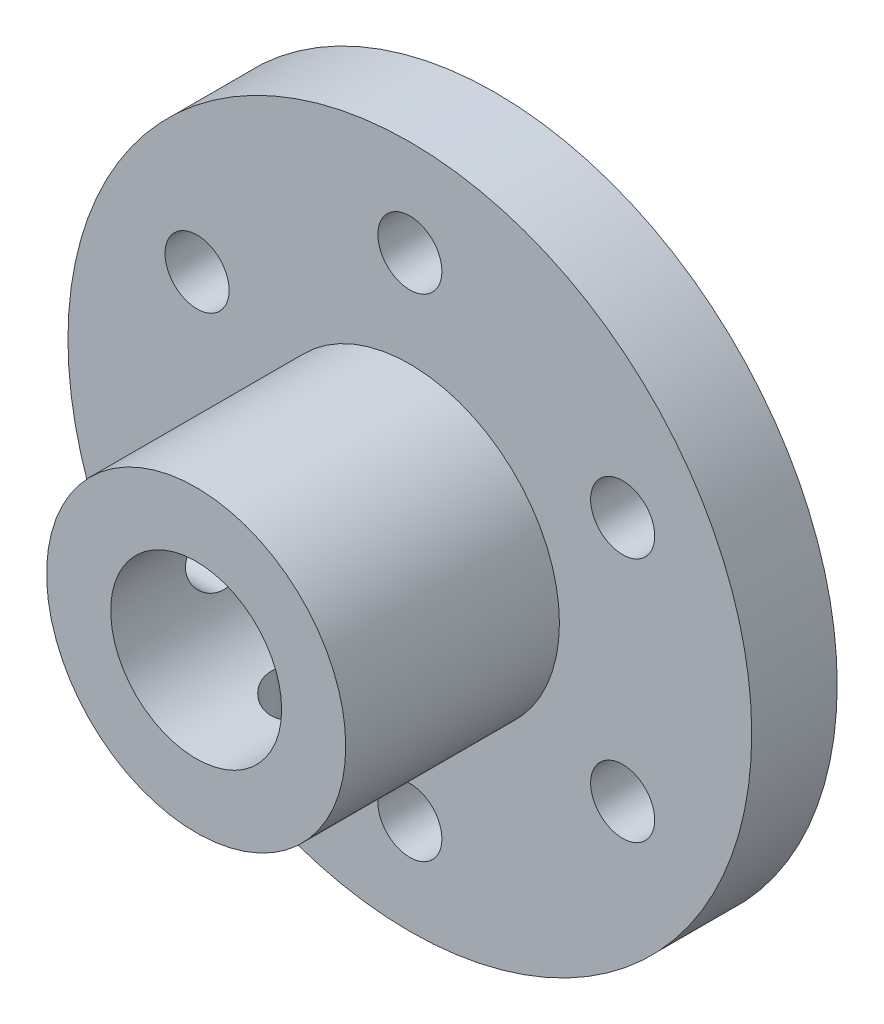
ISO-10303-21;
HEADER;
FILE_DESCRIPTION(('STEP AP214'),'2;1');
FILE_NAME('part.step','',(''),(''),'','','');
FILE_SCHEMA(('AUTOMOTIVE_DESIGN { 1 0 10303 214 1 1 1 1 }'));
ENDSEC;
DATA;
#1=APPLICATION_CONTEXT('core data for automotive mechanical design processes');
#2=APPLICATION_PROTOCOL_DEFINITION('international standard','automotive_design',2000,#1);
#3=PRODUCT_CONTEXT('',#1,'mechanical');
#4=PRODUCT('Part','Part','',(#3));
#5=PRODUCT_RELATED_PRODUCT_CATEGORY('part','',(#4));
#6=PRODUCT_DEFINITION_FORMATION('','',#4);
#7=PRODUCT_DEFINITION_CONTEXT('part definition',#1,'design');
#8=PRODUCT_DEFINITION('design','',#6,#7);
#9=PRODUCT_DEFINITION_SHAPE('','',#8);
#10=(LENGTH_UNIT() NAMED_UNIT(*) SI_UNIT(.MILLI.,.METRE.));
#11=(NAMED_UNIT(*) PLANE_ANGLE_UNIT() SI_UNIT($,.RADIAN.));
#12=(NAMED_UNIT(*) SI_UNIT($,.STERADIAN.) SOLID_ANGLE_UNIT());
#13=UNCERTAINTY_MEASURE_WITH_UNIT(LENGTH_MEASURE(1.E-05),#10,'distance_accuracy_value','');
#14=(GEOMETRIC_REPRESENTATION_CONTEXT(3) GLOBAL_UNCERTAINTY_ASSIGNED_CONTEXT((#13)) GLOBAL_UNIT_ASSIGNED_CONTEXT((#10,
#11,#12)) REPRESENTATION_CONTEXT('',''));
#15=CARTESIAN_POINT('',(0.,0.,0.));
#16=DIRECTION('',(0.,0.,1.));
#17=DIRECTION('',(1.,0.,0.));
#18=AXIS2_PLACEMENT_3D('',#15,#16,#17);
#19=CARTESIAN_POINT('',(0.,0.,4.));
#20=DIRECTION('',(0.,0.,1.));
#21=DIRECTION('',(1.,0.,0.));
#22=AXIS2_PLACEMENT_3D('',#19,#20,#21);
#23=PLANE('',#22);
#24=CARTESIAN_POINT('',(0.,0.,4.));
#25=DIRECTION('',(0.,0.,1.));
#26=DIRECTION('',(1.,0.,0.));
#27=AXIS2_PLACEMENT_3D('',#24,#25,#26);
#28=CIRCLE('',#27,7.);
#29=CARTESIAN_POINT('',(7.,0.,4.));
#30=VERTEX_POINT('',#29);
#31=EDGE_CURVE('E10',#30,#30,#28,.T.);
#32=ORIENTED_EDGE('',*,*,#31,.F.);
#33=EDGE_LOOP('',(#32));
#34=FACE_BOUND('',#33,.T.);
#35=CARTESIAN_POINT('',(9.95929214352109,5.74999999999991,4.));
#36=DIRECTION('',(0.,0.,1.));
#37=DIRECTION('',(1.,0.,0.));
#38=AXIS2_PLACEMENT_3D('',#35,#36,#37);
#39=CIRCLE('',#38,1.5);
#40=CARTESIAN_POINT('',(11.4592921435211,5.74999999999991,4.));
#41=VERTEX_POINT('',#40);
#42=EDGE_CURVE('E65',#41,#41,#39,.T.);
#43=ORIENTED_EDGE('',*,*,#42,.F.);
#44=EDGE_LOOP('',(#43));
#45=FACE_BOUND('',#44,.T.);
#46=CARTESIAN_POINT('',(-9.95929214352102,5.75000000000005,4.));
#47=DIRECTION('',(0.,0.,1.));
#48=DIRECTION('',(1.,0.,0.));
#49=AXIS2_PLACEMENT_3D('',#46,#47,#48);
#50=CIRCLE('',#49,1.5);
#51=CARTESIAN_POINT('',(-8.45929214352102,5.75000000000005,4.));
#52=VERTEX_POINT('',#51);
#53=EDGE_CURVE('E77',#52,#52,#50,.T.);
#54=ORIENTED_EDGE('',*,*,#53,.F.);
#55=EDGE_LOOP('',(#54));
#56=FACE_BOUND('',#55,.T.);
#57=CARTESIAN_POINT('',(0.,-11.5,4.));
#58=DIRECTION('',(0.,0.,1.));
#59=DIRECTION('',(1.,0.,0.));
#60=AXIS2_PLACEMENT_3D('',#57,#58,#59);
#61=CIRCLE('',#60,1.5);
#62=CARTESIAN_POINT('',(1.5,-11.5,4.));
#63=VERTEX_POINT('',#62);
#64=EDGE_CURVE('E89',#63,#63,#61,.T.);
#65=ORIENTED_EDGE('',*,*,#64,.F.);
#66=EDGE_LOOP('',(#65));
#67=FACE_BOUND('',#66,.T.);
#68=CARTESIAN_POINT('',(0.,0.,4.));
#69=DIRECTION('',(0.,0.,1.));
#70=DIRECTION('',(1.,0.,0.));
#71=AXIS2_PLACEMENT_3D('',#68,#69,#70);
#72=CIRCLE('',#71,16.);
#73=CARTESIAN_POINT('',(16.,0.,4.));
#74=VERTEX_POINT('',#73);
#75=EDGE_CURVE('E47',#74,#74,#72,.T.);
#76=ORIENTED_EDGE('',*,*,#75,.T.);
#77=EDGE_LOOP('',(#76));
#78=FACE_BOUND('',#77,.T.);
#79=CARTESIAN_POINT('',(-9.95929214352106,-5.74999999999998,4.));
#80=DIRECTION('',(0.,0.,1.));
#81=DIRECTION('',(1.,0.,0.));
#82=AXIS2_PLACEMENT_3D('',#79,#80,#81);
#83=CIRCLE('',#82,1.5);
#84=CARTESIAN_POINT('',(-8.45929214352106,-5.74999999999998,4.));
#85=VERTEX_POINT('',#84);
#86=EDGE_CURVE('E83',#85,#85,#83,.T.);
#87=ORIENTED_EDGE('',*,*,#86,.F.);
#88=EDGE_LOOP('',(#87));
#89=FACE_BOUND('',#88,.T.);
#90=CARTESIAN_POINT('',(0.,11.5,4.));
#91=DIRECTION('',(0.,0.,1.));
#92=DIRECTION('',(1.,0.,0.));
#93=AXIS2_PLACEMENT_3D('',#90,#91,#92);
#94=CIRCLE('',#93,1.5);
#95=CARTESIAN_POINT('',(1.50000000000008,11.5,4.));
#96=VERTEX_POINT('',#95);
#97=EDGE_CURVE('E71',#96,#96,#94,.T.);
#98=ORIENTED_EDGE('',*,*,#97,.F.);
#99=EDGE_LOOP('',(#98));
#100=FACE_BOUND('',#99,.T.);
#101=CARTESIAN_POINT('',(9.95929214352098,-5.75000000000012,4.));
#102=DIRECTION('',(0.,0.,1.));
#103=DIRECTION('',(1.,0.,0.));
#104=AXIS2_PLACEMENT_3D('',#101,#102,#103);
#105=CIRCLE('',#104,1.5);
#106=CARTESIAN_POINT('',(11.459292143521,-5.75000000000012,4.));
#107=VERTEX_POINT('',#106);
#108=EDGE_CURVE('E58',#107,#107,#105,.T.);
#109=ORIENTED_EDGE('',*,*,#108,.F.);
#110=EDGE_LOOP('',(#109));
#111=FACE_BOUND('',#110,.T.);
#112=ADVANCED_FACE('F34',(#34,#45,#56,#67,#78,#89,#100,#111),#23,.T.);
#113=CARTESIAN_POINT('',(0.,0.,0.));
#114=DIRECTION('',(0.,0.,1.));
#115=DIRECTION('',(1.,0.,0.));
#116=AXIS2_PLACEMENT_3D('',#113,#114,#115);
#117=PLANE('',#116);
#118=CARTESIAN_POINT('',(0.,0.,0.));
#119=DIRECTION('',(0.,0.,1.));
#120=DIRECTION('',(1.,0.,0.));
#121=AXIS2_PLACEMENT_3D('',#118,#119,#120);
#122=CIRCLE('',#121,16.);
#123=CARTESIAN_POINT('',(16.,0.,0.));
#124=VERTEX_POINT('',#123);
#125=EDGE_CURVE('E52',#124,#124,#122,.T.);
#126=ORIENTED_EDGE('',*,*,#125,.F.);
#127=EDGE_LOOP('',(#126));
#128=FACE_BOUND('',#127,.T.);
#129=CARTESIAN_POINT('',(0.,0.,0.));
#130=DIRECTION('',(0.,0.,1.));
#131=DIRECTION('',(1.,0.,0.));
#132=AXIS2_PLACEMENT_3D('',#129,#130,#131);
#133=CIRCLE('',#132,4.);
#134=CARTESIAN_POINT('',(4.,0.,0.));
#135=VERTEX_POINT('',#134);
#136=EDGE_CURVE('E92',#135,#135,#133,.T.);
#137=ORIENTED_EDGE('',*,*,#136,.T.);
#138=EDGE_LOOP('',(#137));
#139=FACE_BOUND('',#138,.T.);
#140=CARTESIAN_POINT('',(0.,-11.5,0.));
#141=DIRECTION('',(0.,0.,1.));
#142=DIRECTION('',(1.,0.,0.));
#143=AXIS2_PLACEMENT_3D('',#140,#141,#142);
#144=CIRCLE('',#143,1.5);
#145=CARTESIAN_POINT('',(1.5,-11.5,0.));
#146=VERTEX_POINT('',#145);
#147=EDGE_CURVE('E86',#146,#146,#144,.T.);
#148=ORIENTED_EDGE('',*,*,#147,.T.);
#149=EDGE_LOOP('',(#148));
#150=FACE_BOUND('',#149,.T.);
#151=CARTESIAN_POINT('',(-9.95929214352106,-5.74999999999998,0.));
#152=DIRECTION('',(0.,0.,1.));
#153=DIRECTION('',(1.,0.,0.));
#154=AXIS2_PLACEMENT_3D('',#151,#152,#153);
#155=CIRCLE('',#154,1.5);
#156=CARTESIAN_POINT('',(-8.45929214352106,-5.74999999999998,0.));
#157=VERTEX_POINT('',#156);
#158=EDGE_CURVE('E80',#157,#157,#155,.T.);
#159=ORIENTED_EDGE('',*,*,#158,.T.);
#160=EDGE_LOOP('',(#159));
#161=FACE_BOUND('',#160,.T.);
#162=CARTESIAN_POINT('',(-9.95929214352102,5.75000000000005,0.));
#163=DIRECTION('',(0.,0.,1.));
#164=DIRECTION('',(1.,0.,0.));
#165=AXIS2_PLACEMENT_3D('',#162,#163,#164);
#166=CIRCLE('',#165,1.5);
#167=CARTESIAN_POINT('',(-8.45929214352102,5.75000000000005,0.));
#168=VERTEX_POINT('',#167);
#169=EDGE_CURVE('E74',#168,#168,#166,.T.);
#170=ORIENTED_EDGE('',*,*,#169,.T.);
#171=EDGE_LOOP('',(#170));
#172=FACE_BOUND('',#171,.T.);
#173=CARTESIAN_POINT('',(0.,11.5,0.));
#174=DIRECTION('',(0.,0.,1.));
#175=DIRECTION('',(1.,0.,0.));
#176=AXIS2_PLACEMENT_3D('',#173,#174,#175);
#177=CIRCLE('',#176,1.5);
#178=CARTESIAN_POINT('',(1.50000000000008,11.5,0.));
#179=VERTEX_POINT('',#178);
#180=EDGE_CURVE('E68',#179,#179,#177,.T.);
#181=ORIENTED_EDGE('',*,*,#180,.T.);
#182=EDGE_LOOP('',(#181));
#183=FACE_BOUND('',#182,.T.);
#184=CARTESIAN_POINT('',(9.95929214352109,5.74999999999991,0.));
#185=DIRECTION('',(0.,0.,1.));
#186=DIRECTION('',(1.,0.,0.));
#187=AXIS2_PLACEMENT_3D('',#184,#185,#186);
#188=CIRCLE('',#187,1.5);
#189=CARTESIAN_POINT('',(11.4592921435211,5.74999999999991,0.));
#190=VERTEX_POINT('',#189);
#191=EDGE_CURVE('E61',#190,#190,#188,.T.);
#192=ORIENTED_EDGE('',*,*,#191,.T.);
#193=EDGE_LOOP('',(#192));
#194=FACE_BOUND('',#193,.T.);
#195=CARTESIAN_POINT('',(9.95929214352098,-5.75000000000012,0.));
#196=DIRECTION('',(0.,0.,1.));
#197=DIRECTION('',(1.,0.,0.));
#198=AXIS2_PLACEMENT_3D('',#195,#196,#197);
#199=CIRCLE('',#198,1.5);
#200=CARTESIAN_POINT('',(11.459292143521,-5.75000000000012,0.));
#201=VERTEX_POINT('',#200);
#202=EDGE_CURVE('E62',#201,#201,#199,.T.);
#203=ORIENTED_EDGE('',*,*,#202,.T.);
#204=EDGE_LOOP('',(#203));
#205=FACE_BOUND('',#204,.T.);
#206=ADVANCED_FACE('F139',(#128,#139,#150,#161,#172,#183,#194,#205),#117,.F.);
#207=CARTESIAN_POINT('',(0.,0.,4.));
#208=DIRECTION('',(0.,0.,-1.));
#209=DIRECTION('',(-1.,0.,0.));
#210=AXIS2_PLACEMENT_3D('',#207,#208,#209);
#211=CYLINDRICAL_SURFACE('',#210,16.);
#212=ORIENTED_EDGE('',*,*,#75,.F.);
#213=EDGE_LOOP('',(#212));
#214=FACE_BOUND('',#213,.T.);
#215=ORIENTED_EDGE('',*,*,#125,.T.);
#216=EDGE_LOOP('',(#215));
#217=FACE_BOUND('',#216,.T.);
#218=ADVANCED_FACE('F36',(#214,#217),#211,.T.);
#219=CARTESIAN_POINT('',(0.,0.,4.));
#220=DIRECTION('',(0.,0.,-1.));
#221=DIRECTION('',(-1.,0.,0.));
#222=AXIS2_PLACEMENT_3D('',#219,#220,#221);
#223=CYLINDRICAL_SURFACE('',#222,4.);
#224=CARTESIAN_POINT('',(-4.,0.,10.5));
#225=CARTESIAN_POINT('',(-4.00000217456151,-0.0812350589378527,10.5000029023031));
#226=CARTESIAN_POINT('',(-3.99750379283184,-0.162450241781792,10.4933802397516));
#227=CARTESIAN_POINT('',(-3.98778696006928,-0.322453452352361,10.4671718047301));
#228=CARTESIAN_POINT('',(-3.98056918893993,-0.401241827987615,10.4475878995294));
#229=CARTESIAN_POINT('',(-3.96218832391545,-0.554060784990878,10.3962469982282));
#230=CARTESIAN_POINT('',(-3.9510328434944,-0.628100224162277,10.3645134831782));
#231=CARTESIAN_POINT('',(-3.92588767765353,-0.769799310160253,10.2898935869842));
#232=CARTESIAN_POINT('',(-3.91189723227548,-0.837457239177879,10.2470042144558));
#233=CARTESIAN_POINT('',(-3.88186246971217,-0.967346417045825,10.1493874689291));
#234=CARTESIAN_POINT('',(-3.86576002583566,-1.02927073015119,10.0942697377406));
#235=CARTESIAN_POINT('',(-3.83360220871327,-1.14324421474363,9.97458956534116));
#236=CARTESIAN_POINT('',(-3.81754685135033,-1.19529036359203,9.91002424391213));
#237=CARTESIAN_POINT('',(-3.78662470617731,-1.28998202215985,9.77028253247679));
#238=CARTESIAN_POINT('',(-3.77182648820818,-1.3321939319576,9.69479563345418));
#239=CARTESIAN_POINT('',(-3.74599860237433,-1.40318646334084,9.53715164583148));
#240=CARTESIAN_POINT('',(-3.73496742975881,-1.43197244961239,9.4549972368449));
#241=CARTESIAN_POINT('',(-3.71854412824136,-1.47408431017549,9.2898832597418));
#242=CARTESIAN_POINT('',(-3.71293924350838,-1.48799593218558,9.20709496156456));
#243=CARTESIAN_POINT('',(-3.70738061461215,-1.50179556531648,9.04018384200616));
#244=CARTESIAN_POINT('',(-3.70742453659305,-1.5016893680263,8.95606158612553));
#245=CARTESIAN_POINT('',(-3.71297511632055,-1.48790429610018,8.79423047478704));
#246=CARTESIAN_POINT('',(-3.71815468871122,-1.47503808509003,8.71643909395583));
#247=CARTESIAN_POINT('',(-3.73284938059529,-1.4374416786833,8.56421284959468));
#248=CARTESIAN_POINT('',(-3.74236515298863,-1.41270969663258,8.48977849338612));
#249=CARTESIAN_POINT('',(-3.76485702190253,-1.35163748571904,8.34472293227177));
#250=CARTESIAN_POINT('',(-3.77789517988166,-1.31508648737101,8.2742005138787));
#251=CARTESIAN_POINT('',(-3.80594210139319,-1.23156073762698,8.14005426240903));
#252=CARTESIAN_POINT('',(-3.82095154457158,-1.18458238728897,8.0764328224803));
#253=CARTESIAN_POINT('',(-3.85248038859113,-1.07781780766549,7.95339633634913));
#254=CARTESIAN_POINT('',(-3.86903347455671,-1.01738298716956,7.89455135925191));
#255=CARTESIAN_POINT('',(-3.90091728164085,-0.887312590819021,7.7876620337942));
#256=CARTESIAN_POINT('',(-3.91624781465952,-0.817675603497364,7.73961934539433));
#257=CARTESIAN_POINT('',(-3.9442639480908,-0.669723436992419,7.65506960293748));
#258=CARTESIAN_POINT('',(-3.95690498259616,-0.591290713844719,7.61875241877894));
#259=CARTESIAN_POINT('',(-3.97778718326962,-0.428836850524583,7.56001739572996));
#260=CARTESIAN_POINT('',(-3.98603030341493,-0.344818210845767,7.53759338343888));
#261=CARTESIAN_POINT('',(-3.99684443228065,-0.178375243148665,7.50837721245806));
#262=CARTESIAN_POINT('',(-3.99969369025686,-0.0961036195622094,7.50081739361749));
#263=CARTESIAN_POINT('',(-4.00025893700126,0.0685724752550239,7.49930893610008));
#264=CARTESIAN_POINT('',(-3.99797606386863,0.150976912983372,7.50535727968323));
#265=CARTESIAN_POINT('',(-3.98871709772643,0.310262048561859,7.53031004230867));
#266=CARTESIAN_POINT('',(-3.98192470962305,0.387233328007335,7.54871154373709));
#267=CARTESIAN_POINT('',(-3.96451477091717,0.53694175495722,7.59718607254732));
#268=CARTESIAN_POINT('',(-3.9538967228203,0.609678350347534,7.62726061794804));
#269=CARTESIAN_POINT('',(-3.92949624407681,0.751247765110155,7.69918641243948));
#270=CARTESIAN_POINT('',(-3.91563000209348,0.819903083557795,7.74135772922339));
#271=CARTESIAN_POINT('',(-3.88626671564664,0.949392711726625,7.83591810317156));
#272=CARTESIAN_POINT('',(-3.87076907009516,1.01022412027045,7.88831093254515));
#273=CARTESIAN_POINT('',(-3.8387332949099,1.12603079874454,8.00540412212428));
#274=CARTESIAN_POINT('',(-3.82218696503729,1.18046154123568,8.0706421827727));
#275=CARTESIAN_POINT('',(-3.79078815746854,1.27771050031903,8.20965138470766));
#276=CARTESIAN_POINT('',(-3.77593583194399,1.32052767414518,8.2834232913885));
#277=CARTESIAN_POINT('',(-3.74966829822463,1.39337773518998,8.43801598677232));
#278=CARTESIAN_POINT('',(-3.73826760328493,1.42335685446918,8.51886474591044));
#279=CARTESIAN_POINT('',(-3.72054032891005,1.46907883466889,8.68500976368782));
#280=CARTESIAN_POINT('',(-3.71421061057491,1.48483050305535,8.77030323619812));
#281=CARTESIAN_POINT('',(-3.70775894792573,1.50086347097839,8.93701615954112));
#282=CARTESIAN_POINT('',(-3.70726444523341,1.50207331495837,9.01833263171689));
#283=CARTESIAN_POINT('',(-3.71158412745292,1.49136715641593,9.17994531627617));
#284=CARTESIAN_POINT('',(-3.71639780898899,1.47945239850124,9.26024162467158));
#285=CARTESIAN_POINT('',(-3.73048141585432,1.44355815630242,9.41504722671655));
#286=CARTESIAN_POINT('',(-3.73961085376663,1.41995798316524,9.48965834624534));
#287=CARTESIAN_POINT('',(-3.76121548297845,1.3616969677992,9.63390550849442));
#288=CARTESIAN_POINT('',(-3.77369151995215,1.32703332944945,9.70354028807014));
#289=CARTESIAN_POINT('',(-3.80139723903965,1.24552075938154,9.83982678969763));
#290=CARTESIAN_POINT('',(-3.81673698440964,1.1981283280301,9.90613079679991));
#291=CARTESIAN_POINT('',(-3.84806246757177,1.09334485729906,10.0301415609712));
#292=CARTESIAN_POINT('',(-3.86404840943145,1.03595064012808,10.0878455747868));
#293=CARTESIAN_POINT('',(-3.89590424609881,0.909080396784623,10.1962019558218));
#294=CARTESIAN_POINT('',(-3.91172104900645,0.839118644212993,10.2463037534347));
#295=CARTESIAN_POINT('',(-3.94054514457031,0.691213223200822,10.3340226552766));
#296=CARTESIAN_POINT('',(-3.95355221851559,0.613268934090622,10.3716387877364));
#297=CARTESIAN_POINT('',(-3.9757429260668,0.447999082002313,10.4343768290483));
#298=CARTESIAN_POINT('',(-3.98473657158356,0.360413422234209,10.4588870646019));
#299=CARTESIAN_POINT('',(-3.99686242179587,0.181875733606382,10.4916929599207));
#300=CARTESIAN_POINT('',(-3.99999756603967,0.0909254163648591,10.4999967514873));
#301=CARTESIAN_POINT('',(-4.,0.,10.5));
#302=B_SPLINE_CURVE_WITH_KNOTS('',3,(#224,#225,#226,#227,#228,#229,#230,#231,#232,#233,#234,
#235,#236,#237,#238,#239,#240,#241,#242,#243,#244,#245,#246,#247,#248,#249,#250,#251,#252,#253,
#254,#255,#256,#257,#258,#259,#260,#261,#262,#263,#264,#265,#266,#267,#268,#269,#270,#271,#272,
#273,#274,#275,#276,#277,#278,#279,#280,#281,#282,#283,#284,#285,#286,#287,#288,#289,#290,#291,
#292,#293,#294,#295,#296,#297,#298,#299,#300,#301),.UNSPECIFIED.,.T.,.F.,(4,2,2,2,2,2,2,2,2,2,2,
2,2,2,2,2,2,2,2,2,2,2,2,2,2,2,2,2,2,2,2,2,2,2,2,2,2,2,4),(0.,0.243369801560559,0.48670454953046,
0.729571369213572,0.972503379609489,1.22473618582715,1.47704604925622,1.73896674501659,
2.00078269352134,2.25185874416901,2.50283106079707,2.73878345119971,2.97477138060589,
3.21522408387018,3.45575990744258,3.71246153335812,3.96920257905066,4.22991375286075,
4.49050899698846,4.73725019635925,4.9839366839052,5.2211443792384,5.45838293254453,
5.70259221859599,5.94689180019868,6.20536519455657,6.46386178920141,6.72343066727203,
6.98283874956506,7.22558763480252,7.46831350211258,7.70363142426533,7.93900886656506,
8.1867247188427,8.43451941997061,8.69572329654038,8.95694749805102,9.22948515032042,
9.50188601796127),.UNSPECIFIED.);
#303=CARTESIAN_POINT('',(-4.,0.,10.5));
#304=VERTEX_POINT('',#303);
#305=EDGE_CURVE('E105',#304,#304,#302,.T.);
#306=ORIENTED_EDGE('',*,*,#305,.F.);
#307=EDGE_LOOP('',(#306));
#308=FACE_BOUND('',#307,.T.);
#309=CARTESIAN_POINT('',(0.,-4.,10.5));
#310=CARTESIAN_POINT('',(0.0812350589378528,-4.00000217456151,10.5000029023031));
#311=CARTESIAN_POINT('',(0.162450241781792,-3.99750379283184,10.4933802397516));
#312=CARTESIAN_POINT('',(0.322453452352361,-3.98778696006928,10.4671718047301));
#313=CARTESIAN_POINT('',(0.401241827987615,-3.98056918893993,10.4475878995294));
#314=CARTESIAN_POINT('',(0.554060784990879,-3.96218832391545,10.3962469982282));
#315=CARTESIAN_POINT('',(0.628100224162279,-3.9510328434944,10.3645134831782));
#316=CARTESIAN_POINT('',(0.769799310160254,-3.92588767765353,10.2898935869842));
#317=CARTESIAN_POINT('',(0.837457239177879,-3.91189723227548,10.2470042144558));
#318=CARTESIAN_POINT('',(0.967346417045825,-3.88186246971217,10.1493874689291));
#319=CARTESIAN_POINT('',(1.02927073015119,-3.86576002583566,10.0942697377406));
#320=CARTESIAN_POINT('',(1.14324421474363,-3.83360220871327,9.97458956534116));
#321=CARTESIAN_POINT('',(1.19529036359203,-3.81754685135033,9.91002424391213));
#322=CARTESIAN_POINT('',(1.28998202215985,-3.78662470617731,9.77028253247679));
#323=CARTESIAN_POINT('',(1.3321939319576,-3.77182648820818,9.69479563345418));
#324=CARTESIAN_POINT('',(1.40318646334084,-3.74599860237433,9.53715164583148));
#325=CARTESIAN_POINT('',(1.43197244961239,-3.73496742975881,9.4549972368449));
#326=CARTESIAN_POINT('',(1.47408431017549,-3.71854412824136,9.2898832597418));
#327=CARTESIAN_POINT('',(1.48799593218558,-3.71293924350838,9.20709496156456));
#328=CARTESIAN_POINT('',(1.50179556531648,-3.70738061461215,9.04018384200616));
#329=CARTESIAN_POINT('',(1.5016893680263,-3.70742453659305,8.95606158612553));
#330=CARTESIAN_POINT('',(1.48790429610018,-3.71297511632055,8.79423047478704));
#331=CARTESIAN_POINT('',(1.47503808509003,-3.71815468871122,8.71643909395583));
#332=CARTESIAN_POINT('',(1.4374416786833,-3.73284938059529,8.56421284959468));
#333=CARTESIAN_POINT('',(1.41270969663258,-3.74236515298863,8.48977849338612));
#334=CARTESIAN_POINT('',(1.35163748571904,-3.76485702190253,8.34472293227177));
#335=CARTESIAN_POINT('',(1.31508648737101,-3.77789517988166,8.2742005138787));
#336=CARTESIAN_POINT('',(1.23156073762698,-3.80594210139319,8.14005426240903));
#337=CARTESIAN_POINT('',(1.18458238728896,-3.82095154457158,8.0764328224803));
#338=CARTESIAN_POINT('',(1.07781780766549,-3.85248038859113,7.95339633634912));
#339=CARTESIAN_POINT('',(1.01738298716955,-3.86903347455671,7.89455135925191));
#340=CARTESIAN_POINT('',(0.88731259081902,-3.90091728164086,7.7876620337942));
#341=CARTESIAN_POINT('',(0.817675603497364,-3.91624781465952,7.73961934539433));
#342=CARTESIAN_POINT('',(0.669723436992419,-3.9442639480908,7.65506960293748));
#343=CARTESIAN_POINT('',(0.591290713844718,-3.95690498259616,7.61875241877894));
#344=CARTESIAN_POINT('',(0.428836850524582,-3.97778718326962,7.56001739572996));
#345=CARTESIAN_POINT('',(0.344818210845767,-3.98603030341493,7.53759338343888));
#346=CARTESIAN_POINT('',(0.178375243148665,-3.99684443228065,7.50837721245806));
#347=CARTESIAN_POINT('',(0.0961036195622093,-3.99969369025686,7.50081739361749));
#348=CARTESIAN_POINT('',(-0.0685724752550243,-4.00025893700126,7.49930893610008));
#349=CARTESIAN_POINT('',(-0.150976912983373,-3.99797606386863,7.50535727968322));
#350=CARTESIAN_POINT('',(-0.310262048561859,-3.98871709772643,7.53031004230867));
#351=CARTESIAN_POINT('',(-0.387233328007336,-3.98192470962305,7.54871154373709));
#352=CARTESIAN_POINT('',(-0.536941754957221,-3.96451477091717,7.59718607254732));
#353=CARTESIAN_POINT('',(-0.609678350347535,-3.9538967228203,7.62726061794804));
#354=CARTESIAN_POINT('',(-0.751247765110156,-3.92949624407681,7.69918641243948));
#355=CARTESIAN_POINT('',(-0.819903083557796,-3.91563000209348,7.74135772922339));
#356=CARTESIAN_POINT('',(-0.949392711726626,-3.88626671564664,7.83591810317156));
#357=CARTESIAN_POINT('',(-1.01022412027045,-3.87076907009516,7.88831093254515));
#358=CARTESIAN_POINT('',(-1.12603079874454,-3.8387332949099,8.00540412212428));
#359=CARTESIAN_POINT('',(-1.18046154123569,-3.82218696503729,8.0706421827727));
#360=CARTESIAN_POINT('',(-1.27771050031903,-3.79078815746854,8.20965138470766));
#361=CARTESIAN_POINT('',(-1.32052767414518,-3.77593583194399,8.2834232913885));
#362=CARTESIAN_POINT('',(-1.39337773518998,-3.74966829822463,8.43801598677231));
#363=CARTESIAN_POINT('',(-1.42335685446918,-3.73826760328493,8.51886474591043));
#364=CARTESIAN_POINT('',(-1.46907883466889,-3.72054032891005,8.68500976368782));
#365=CARTESIAN_POINT('',(-1.48483050305535,-3.71421061057491,8.77030323619812));
#366=CARTESIAN_POINT('',(-1.50086347097839,-3.70775894792573,8.93701615954112));
#367=CARTESIAN_POINT('',(-1.50207331495837,-3.70726444523341,9.01833263171689));
#368=CARTESIAN_POINT('',(-1.49136715641593,-3.71158412745292,9.17994531627617));
#369=CARTESIAN_POINT('',(-1.47945239850124,-3.71639780898899,9.26024162467158));
#370=CARTESIAN_POINT('',(-1.44355815630242,-3.73048141585432,9.41504722671655));
#371=CARTESIAN_POINT('',(-1.41995798316524,-3.73961085376663,9.48965834624535));
#372=CARTESIAN_POINT('',(-1.3616969677992,-3.76121548297845,9.63390550849442));
#373=CARTESIAN_POINT('',(-1.32703332944945,-3.77369151995215,9.70354028807014));
#374=CARTESIAN_POINT('',(-1.24552075938154,-3.80139723903965,9.83982678969763));
#375=CARTESIAN_POINT('',(-1.1981283280301,-3.81673698440964,9.90613079679991));
#376=CARTESIAN_POINT('',(-1.09334485729906,-3.84806246757177,10.0301415609712));
#377=CARTESIAN_POINT('',(-1.03595064012808,-3.86404840943145,10.0878455747868));
#378=CARTESIAN_POINT('',(-0.909080396784623,-3.89590424609881,10.1962019558218));
#379=CARTESIAN_POINT('',(-0.839118644212993,-3.91172104900645,10.2463037534347));
#380=CARTESIAN_POINT('',(-0.691213223200821,-3.94054514457031,10.3340226552766));
#381=CARTESIAN_POINT('',(-0.613268934090621,-3.95355221851559,10.3716387877364));
#382=CARTESIAN_POINT('',(-0.447999082002311,-3.9757429260668,10.4343768290483));
#383=CARTESIAN_POINT('',(-0.360413422234207,-3.98473657158356,10.4588870646019));
#384=CARTESIAN_POINT('',(-0.181875733606381,-3.99686242179587,10.4916929599207));
#385=CARTESIAN_POINT('',(-0.0909254163648585,-3.99999756603967,10.4999967514873));
#386=CARTESIAN_POINT('',(0.,-4.,10.5));
#387=B_SPLINE_CURVE_WITH_KNOTS('',3,(#309,#310,#311,#312,#313,#314,#315,#316,#317,#318,#319,
#320,#321,#322,#323,#324,#325,#326,#327,#328,#329,#330,#331,#332,#333,#334,#335,#336,#337,#338,
#339,#340,#341,#342,#343,#344,#345,#346,#347,#348,#349,#350,#351,#352,#353,#354,#355,#356,#357,
#358,#359,#360,#361,#362,#363,#364,#365,#366,#367,#368,#369,#370,#371,#372,#373,#374,#375,#376,
#377,#378,#379,#380,#381,#382,#383,#384,#385,#386),.UNSPECIFIED.,.T.,.F.,(4,2,2,2,2,2,2,2,2,2,2,
2,2,2,2,2,2,2,2,2,2,2,2,2,2,2,2,2,2,2,2,2,2,2,2,2,2,2,4),(0.,0.243369801560559,0.48670454953046,
0.729571369213574,0.972503379609489,1.22473618582715,1.47704604925622,1.73896674501658,
2.00078269352134,2.25185874416901,2.50283106079707,2.73878345119971,2.97477138060589,
3.21522408387018,3.45575990744258,3.71246153335813,3.96920257905066,4.22991375286075,
4.49050899698846,4.73725019635925,4.9839366839052,5.2211443792384,5.45838293254453,
5.702592218596,5.94689180019868,6.20536519455658,6.46386178920141,6.72343066727204,
6.98283874956507,7.22558763480252,7.46831350211259,7.70363142426533,7.93900886656506,
8.1867247188427,8.43451941997062,8.69572329654039,8.95694749805102,9.22948515032042,
9.50188601796127),.UNSPECIFIED.);
#388=CARTESIAN_POINT('',(0.,-4.,10.5));
#389=VERTEX_POINT('',#388);
#390=EDGE_CURVE('E104',#389,#389,#387,.T.);
#391=ORIENTED_EDGE('',*,*,#390,.F.);
#392=EDGE_LOOP('',(#391));
#393=FACE_BOUND('',#392,.T.);
#394=ORIENTED_EDGE('',*,*,#136,.F.);
#395=EDGE_LOOP('',(#394));
#396=FACE_BOUND('',#395,.T.);
#397=CARTESIAN_POINT('',(0.,0.,14.));
#398=DIRECTION('',(0.,0.,1.));
#399=DIRECTION('',(1.,0.,0.));
#400=AXIS2_PLACEMENT_3D('',#397,#398,#399);
#401=CIRCLE('',#400,4.);
#402=CARTESIAN_POINT('',(4.,0.,14.));
#403=VERTEX_POINT('',#402);
#404=EDGE_CURVE('E125',#403,#403,#401,.T.);
#405=ORIENTED_EDGE('',*,*,#404,.T.);
#406=EDGE_LOOP('',(#405));
#407=FACE_BOUND('',#406,.T.);
#408=ADVANCED_FACE('F129',(#308,#393,#396,#407),#223,.F.);
#409=CARTESIAN_POINT('',(0.,-11.5,4.));
#410=DIRECTION('',(0.,0.,-1.));
#411=DIRECTION('',(-1.,0.,0.));
#412=AXIS2_PLACEMENT_3D('',#409,#410,#411);
#413=CYLINDRICAL_SURFACE('',#412,1.5);
#414=ORIENTED_EDGE('',*,*,#64,.T.);
#415=EDGE_LOOP('',(#414));
#416=FACE_BOUND('',#415,.T.);
#417=ORIENTED_EDGE('',*,*,#147,.F.);
#418=EDGE_LOOP('',(#417));
#419=FACE_BOUND('',#418,.T.);
#420=ADVANCED_FACE('F134',(#416,#419),#413,.F.);
#421=CARTESIAN_POINT('',(-9.95929214352106,-5.74999999999998,4.));
#422=DIRECTION('',(0.,0.,-1.));
#423=DIRECTION('',(-1.,0.,0.));
#424=AXIS2_PLACEMENT_3D('',#421,#422,#423);
#425=CYLINDRICAL_SURFACE('',#424,1.5);
#426=ORIENTED_EDGE('',*,*,#86,.T.);
#427=EDGE_LOOP('',(#426));
#428=FACE_BOUND('',#427,.T.);
#429=ORIENTED_EDGE('',*,*,#158,.F.);
#430=EDGE_LOOP('',(#429));
#431=FACE_BOUND('',#430,.T.);
#432=ADVANCED_FACE('F181',(#428,#431),#425,.F.);
#433=CARTESIAN_POINT('',(-9.95929214352102,5.75000000000005,4.));
#434=DIRECTION('',(0.,0.,-1.));
#435=DIRECTION('',(-1.,0.,0.));
#436=AXIS2_PLACEMENT_3D('',#433,#434,#435);
#437=CYLINDRICAL_SURFACE('',#436,1.5);
#438=ORIENTED_EDGE('',*,*,#53,.T.);
#439=EDGE_LOOP('',(#438));
#440=FACE_BOUND('',#439,.T.);
#441=ORIENTED_EDGE('',*,*,#169,.F.);
#442=EDGE_LOOP('',(#441));
#443=FACE_BOUND('',#442,.T.);
#444=ADVANCED_FACE('F178',(#440,#443),#437,.F.);
#445=CARTESIAN_POINT('',(0.,11.5,4.));
#446=DIRECTION('',(0.,0.,-1.));
#447=DIRECTION('',(-1.,0.,0.));
#448=AXIS2_PLACEMENT_3D('',#445,#446,#447);
#449=CYLINDRICAL_SURFACE('',#448,1.5);
#450=ORIENTED_EDGE('',*,*,#97,.T.);
#451=EDGE_LOOP('',(#450));
#452=FACE_BOUND('',#451,.T.);
#453=ORIENTED_EDGE('',*,*,#180,.F.);
#454=EDGE_LOOP('',(#453));
#455=FACE_BOUND('',#454,.T.);
#456=ADVANCED_FACE('F172',(#452,#455),#449,.F.);
#457=CARTESIAN_POINT('',(9.95929214352109,5.74999999999991,4.));
#458=DIRECTION('',(0.,0.,-1.));
#459=DIRECTION('',(-1.,0.,0.));
#460=AXIS2_PLACEMENT_3D('',#457,#458,#459);
#461=CYLINDRICAL_SURFACE('',#460,1.5);
#462=ORIENTED_EDGE('',*,*,#42,.T.);
#463=EDGE_LOOP('',(#462));
#464=FACE_BOUND('',#463,.T.);
#465=ORIENTED_EDGE('',*,*,#191,.F.);
#466=EDGE_LOOP('',(#465));
#467=FACE_BOUND('',#466,.T.);
#468=ADVANCED_FACE('F165',(#464,#467),#461,.F.);
#469=CARTESIAN_POINT('',(9.95929214352098,-5.75000000000012,4.));
#470=DIRECTION('',(0.,0.,-1.));
#471=DIRECTION('',(-1.,0.,0.));
#472=AXIS2_PLACEMENT_3D('',#469,#470,#471);
#473=CYLINDRICAL_SURFACE('',#472,1.5);
#474=ORIENTED_EDGE('',*,*,#108,.T.);
#475=EDGE_LOOP('',(#474));
#476=FACE_BOUND('',#475,.T.);
#477=ORIENTED_EDGE('',*,*,#202,.F.);
#478=EDGE_LOOP('',(#477));
#479=FACE_BOUND('',#478,.T.);
#480=ADVANCED_FACE('F163',(#476,#479),#473,.F.);
#481=CARTESIAN_POINT('',(0.,0.,14.));
#482=DIRECTION('',(0.,0.,1.));
#483=DIRECTION('',(1.,0.,0.));
#484=AXIS2_PLACEMENT_3D('',#481,#482,#483);
#485=PLANE('',#484);
#486=CARTESIAN_POINT('',(0.,0.,14.));
#487=DIRECTION('',(0.,0.,1.));
#488=DIRECTION('',(1.,0.,0.));
#489=AXIS2_PLACEMENT_3D('',#486,#487,#488);
#490=CIRCLE('',#489,7.);
#491=CARTESIAN_POINT('',(7.,0.,14.));
#492=VERTEX_POINT('',#491);
#493=EDGE_CURVE('E56',#492,#492,#490,.T.);
#494=ORIENTED_EDGE('',*,*,#493,.T.);
#495=EDGE_LOOP('',(#494));
#496=FACE_BOUND('',#495,.T.);
#497=ORIENTED_EDGE('',*,*,#404,.F.);
#498=EDGE_LOOP('',(#497));
#499=FACE_BOUND('',#498,.T.);
#500=ADVANCED_FACE('F116',(#496,#499),#485,.T.);
#501=CARTESIAN_POINT('',(0.,0.,14.));
#502=DIRECTION('',(0.,0.,-1.));
#503=DIRECTION('',(-1.,0.,0.));
#504=AXIS2_PLACEMENT_3D('',#501,#502,#503);
#505=CYLINDRICAL_SURFACE('',#504,7.);
#506=CARTESIAN_POINT('',(-7.,0.,10.5));
#507=CARTESIAN_POINT('',(-6.99999846043226,-0.0832358860906164,10.4999971004257));
#508=CARTESIAN_POINT('',(-6.9985002594971,-0.166507195600274,10.4930483916121));
#509=CARTESIAN_POINT('',(-6.99266829827728,-0.330687344293327,10.4654643431464));
#510=CARTESIAN_POINT('',(-6.98833245637099,-0.41159440357119,10.4448189558051));
#511=CARTESIAN_POINT('',(-6.97730831788826,-0.568649323817736,10.390515635392));
#512=CARTESIAN_POINT('',(-6.97062242967171,-0.644801963446555,10.3568710206187));
#513=CARTESIAN_POINT('',(-6.95562106817971,-0.790378177960786,10.2775659138287));
#514=CARTESIAN_POINT('',(-6.94730565036661,-0.859801981747368,10.2319058307501));
#515=CARTESIAN_POINT('',(-6.92981369246311,-0.991024790535229,10.1291197003265));
#516=CARTESIAN_POINT('',(-6.92062683143259,-1.05270503419445,10.0718437781015));
#517=CARTESIAN_POINT('',(-6.90250069814144,-1.16566042389435,9.9477736843148));
#518=CARTESIAN_POINT('',(-6.8935614473163,-1.21693467150908,9.88097869174874));
#519=CARTESIAN_POINT('',(-6.87684116047225,-1.30814204379808,9.73889424713957));
#520=CARTESIAN_POINT('',(-6.8690733634436,-1.34794958335009,9.66352248224379));
#521=CARTESIAN_POINT('',(-6.85572325558537,-1.41428823691147,9.50696554623316));
#522=CARTESIAN_POINT('',(-6.85014069470711,-1.44082087001716,9.42578104150743));
#523=CARTESIAN_POINT('',(-6.84189808926311,-1.47946574422454,9.26118891341193));
#524=CARTESIAN_POINT('',(-6.83919556896486,-1.49178779748342,9.17783272433614));
#525=CARTESIAN_POINT('',(-6.83689139845106,-1.50231395206577,9.01019576749301));
#526=CARTESIAN_POINT('',(-6.83728938291729,-1.50051971664629,8.92591510982005));
#527=CARTESIAN_POINT('',(-6.84110276603832,-1.48303326340861,8.76037531206621));
#528=CARTESIAN_POINT('',(-6.84446541682162,-1.46758398649408,8.67908911089985));
#529=CARTESIAN_POINT('',(-6.85374593375788,-1.42361054298677,8.52028975971066));
#530=CARTESIAN_POINT('',(-6.85966393808402,-1.39508566936466,8.44277681396768));
#531=CARTESIAN_POINT('',(-6.87344080755724,-1.32554551075991,8.29303712712666));
#532=CARTESIAN_POINT('',(-6.88131420983365,-1.2844361097283,8.22085548728745));
#533=CARTESIAN_POINT('',(-6.89810572501288,-1.19096007283993,8.08432483504205));
#534=CARTESIAN_POINT('',(-6.90702397481896,-1.13859196103562,8.0199768513138));
#535=CARTESIAN_POINT('',(-6.92512718393878,-1.0227954275532,7.8995406443266));
#536=CARTESIAN_POINT('',(-6.93431383972178,-0.959160233964411,7.84365129341526));
#537=CARTESIAN_POINT('',(-6.95175017497059,-0.823317306269097,7.74330626631034));
#538=CARTESIAN_POINT('',(-6.95999983875972,-0.7511094287754,7.69885078139961));
#539=CARTESIAN_POINT('',(-6.97465778534003,-0.599933462049959,7.62258932009307));
#540=CARTESIAN_POINT('',(-6.98106238643354,-0.520952258863483,7.59080858742202));
#541=CARTESIAN_POINT('',(-6.99128109245334,-0.358603146685706,7.54102435167892));
#542=CARTESIAN_POINT('',(-6.99509555860384,-0.275235851133669,7.52301892743669));
#543=CARTESIAN_POINT('',(-6.99965306347808,-0.108187670836629,7.50158378585658));
#544=CARTESIAN_POINT('',(-7.00045336521066,-0.024543177271615,7.49788228711822));
#545=CARTESIAN_POINT('',(-6.99905248935969,0.142168973650404,7.50442457112517));
#546=CARTESIAN_POINT('',(-6.99685150675698,0.225236668127254,7.51466744796294));
#547=CARTESIAN_POINT('',(-6.98973143045266,0.387542537982805,7.5485822436617));
#548=CARTESIAN_POINT('',(-6.9848410504546,0.466811712908477,7.57211236947254));
#549=CARTESIAN_POINT('',(-6.9728892442151,0.620278450473417,7.63177694299482));
#550=CARTESIAN_POINT('',(-6.96582763822237,0.694475592587739,7.66791243431166));
#551=CARTESIAN_POINT('',(-6.950175043904,0.836821397964753,7.75233354306033));
#552=CARTESIAN_POINT('',(-6.94156431354275,0.904872575111139,7.80077979490973));
#553=CARTESIAN_POINT('',(-6.92381033034847,1.03197692552359,7.90823482488874));
#554=CARTESIAN_POINT('',(-6.91466701142097,1.091028978692,7.96724491588745));
#555=CARTESIAN_POINT('',(-6.89668172706324,1.19952711057989,8.09539737018714));
#556=CARTESIAN_POINT('',(-6.88784792221285,1.24878537255156,8.1647000992221));
#557=CARTESIAN_POINT('',(-6.87166654559681,1.3349641538604,8.310754596478));
#558=CARTESIAN_POINT('',(-6.86431891048055,1.37188519913706,8.38750604697749));
#559=CARTESIAN_POINT('',(-6.8520100980739,1.43209741248548,8.54587229899461));
#560=CARTESIAN_POINT('',(-6.84703574582967,1.45546398641275,8.62745735643067));
#561=CARTESIAN_POINT('',(-6.84001186708418,1.48812696085335,8.79351558383364));
#562=CARTESIAN_POINT('',(-6.83796189439706,1.49742550780258,8.87798831120132));
#563=CARTESIAN_POINT('',(-6.83704618848155,1.5015999992604,9.04553234317524));
#564=CARTESIAN_POINT('',(-6.83811476518543,1.49677347258311,9.12859601498058));
#565=CARTESIAN_POINT('',(-6.8431676318483,1.47349789406331,9.29269724213259));
#566=CARTESIAN_POINT('',(-6.84715189026714,1.45504898957979,9.37373481938657));
#567=CARTESIAN_POINT('',(-6.85755581104157,1.40519345940434,9.53125865786917));
#568=CARTESIAN_POINT('',(-6.86396764224703,1.37382847170887,9.60775864866429));
#569=CARTESIAN_POINT('',(-6.87850764590649,1.29906751595601,9.75445537250685));
#570=CARTESIAN_POINT('',(-6.88663598880363,1.255670353015,9.82465147861504));
#571=CARTESIAN_POINT('',(-6.90389055593232,1.15708290349304,9.95821819372536));
#572=CARTESIAN_POINT('',(-6.91303309938926,1.10167987421237,10.021429695947));
#573=CARTESIAN_POINT('',(-6.93117449799694,0.981086554619621,10.1377562625205));
#574=CARTESIAN_POINT('',(-6.94017331951296,0.915894009385597,10.1908689943122));
#575=CARTESIAN_POINT('',(-6.95714491048987,0.776603147268717,10.2861159595056));
#576=CARTESIAN_POINT('',(-6.96510364570626,0.702404846009641,10.328106606231));
#577=CARTESIAN_POINT('',(-6.97895826104019,0.547850160940598,10.3989545289062));
#578=CARTESIAN_POINT('',(-6.98485590212343,0.46749910586388,10.427823022585));
#579=CARTESIAN_POINT('',(-6.99284848461772,0.322535217553205,10.4663521851312));
#580=CARTESIAN_POINT('',(-6.99551391888263,0.25871720554598,10.47894643398));
#581=CARTESIAN_POINT('',(-6.99909024154719,0.129939960853847,10.4957713017117));
#582=CARTESIAN_POINT('',(-7.00000120191314,0.0649807750887451,10.5000022636461));
#583=CARTESIAN_POINT('',(-7.,0.,10.5));
#584=B_SPLINE_CURVE_WITH_KNOTS('',3,(#506,#507,#508,#509,#510,#511,#512,#513,#514,#515,#516,
#517,#518,#519,#520,#521,#522,#523,#524,#525,#526,#527,#528,#529,#530,#531,#532,#533,#534,#535,
#536,#537,#538,#539,#540,#541,#542,#543,#544,#545,#546,#547,#548,#549,#550,#551,#552,#553,#554,
#555,#556,#557,#558,#559,#560,#561,#562,#563,#564,#565,#566,#567,#568,#569,#570,#571,#572,#573,
#574,#575,#576,#577,#578,#579,#580,#581,#582,#583),.UNSPECIFIED.,.T.,.F.,(4,2,2,2,2,2,2,2,2,2,2,
2,2,2,2,2,2,2,2,2,2,2,2,2,2,2,2,2,2,2,2,2,2,2,2,2,2,2,4),(0.,0.249469836512081,
0.499122883219935,0.748520824425601,0.997910278645885,1.25074961881732,1.50361077918506,
1.7591442921451,2.0146485567749,2.26633008124666,2.51798195169165,2.76524475452927,
3.01252092904568,3.26169356165967,3.51089887920889,3.76527011050291,4.0196455970235,
4.27452521139806,4.52936927256343,4.77934665704185,5.02930780231429,5.27665060589267,
5.52401389198434,5.77478733867803,6.02559197304484,6.28082063283534,6.53603841075805,
6.78982240408475,7.04356767229185,7.29200680540293,7.5404432510827,7.78808499706785,
8.03575134451622,8.28822950154113,8.54076590397114,8.79641910357222,9.0518533401027,
9.24661799132293,9.44137465337335),.UNSPECIFIED.);
#585=CARTESIAN_POINT('',(-7.,0.,10.5));
#586=VERTEX_POINT('',#585);
#587=EDGE_CURVE('E38',#586,#586,#584,.T.);
#588=ORIENTED_EDGE('',*,*,#587,.T.);
#589=EDGE_LOOP('',(#588));
#590=FACE_BOUND('',#589,.T.);
#591=CARTESIAN_POINT('',(0.,-7.,10.5));
#592=CARTESIAN_POINT('',(0.0832358860906164,-6.99999846043226,10.4999971004257));
#593=CARTESIAN_POINT('',(0.166507195600274,-6.9985002594971,10.4930483916121));
#594=CARTESIAN_POINT('',(0.330687344293327,-6.99266829827728,10.4654643431464));
#595=CARTESIAN_POINT('',(0.41159440357119,-6.98833245637099,10.4448189558051));
#596=CARTESIAN_POINT('',(0.568649323817736,-6.97730831788827,10.390515635392));
#597=CARTESIAN_POINT('',(0.644801963446555,-6.97062242967171,10.3568710206187));
#598=CARTESIAN_POINT('',(0.790378177960787,-6.95562106817971,10.2775659138287));
#599=CARTESIAN_POINT('',(0.859801981747369,-6.94730565036661,10.2319058307501));
#600=CARTESIAN_POINT('',(0.991024790535229,-6.92981369246311,10.1291197003265));
#601=CARTESIAN_POINT('',(1.05270503419445,-6.92062683143259,10.0718437781015));
#602=CARTESIAN_POINT('',(1.16566042389435,-6.90250069814144,9.9477736843148));
#603=CARTESIAN_POINT('',(1.21693467150908,-6.8935614473163,9.88097869174874));
#604=CARTESIAN_POINT('',(1.30814204379808,-6.87684116047225,9.73889424713957));
#605=CARTESIAN_POINT('',(1.34794958335009,-6.8690733634436,9.66352248224379));
#606=CARTESIAN_POINT('',(1.41428823691148,-6.85572325558537,9.50696554623316));
#607=CARTESIAN_POINT('',(1.44082087001716,-6.85014069470711,9.42578104150743));
#608=CARTESIAN_POINT('',(1.47946574422454,-6.84189808926311,9.26118891341193));
#609=CARTESIAN_POINT('',(1.49178779748342,-6.83919556896486,9.17783272433614));
#610=CARTESIAN_POINT('',(1.50231395206577,-6.83689139845106,9.01019576749301));
#611=CARTESIAN_POINT('',(1.50051971664629,-6.83728938291729,8.92591510982005));
#612=CARTESIAN_POINT('',(1.48303326340861,-6.84110276603832,8.76037531206621));
#613=CARTESIAN_POINT('',(1.46758398649408,-6.84446541682162,8.67908911089985));
#614=CARTESIAN_POINT('',(1.42361054298677,-6.85374593375788,8.52028975971066));
#615=CARTESIAN_POINT('',(1.39508566936466,-6.85966393808402,8.44277681396768));
#616=CARTESIAN_POINT('',(1.32554551075991,-6.87344080755724,8.29303712712666));
#617=CARTESIAN_POINT('',(1.2844361097283,-6.88131420983365,8.22085548728745));
#618=CARTESIAN_POINT('',(1.19096007283993,-6.89810572501288,8.08432483504205));
#619=CARTESIAN_POINT('',(1.13859196103562,-6.90702397481896,8.0199768513138));
#620=CARTESIAN_POINT('',(1.0227954275532,-6.92512718393878,7.89954064432661));
#621=CARTESIAN_POINT('',(0.959160233964411,-6.93431383972178,7.84365129341526));
#622=CARTESIAN_POINT('',(0.823317306269098,-6.95175017497059,7.74330626631034));
#623=CARTESIAN_POINT('',(0.751109428775401,-6.95999983875972,7.69885078139961));
#624=CARTESIAN_POINT('',(0.59993346204996,-6.97465778534003,7.62258932009307));
#625=CARTESIAN_POINT('',(0.520952258863484,-6.98106238643354,7.59080858742202));
#626=CARTESIAN_POINT('',(0.358603146685708,-6.99128109245334,7.54102435167892));
#627=CARTESIAN_POINT('',(0.27523585113367,-6.99509555860384,7.52301892743669));
#628=CARTESIAN_POINT('',(0.10818767083663,-6.99965306347808,7.50158378585658));
#629=CARTESIAN_POINT('',(0.0245431772716161,-7.00045336521066,7.49788228711822));
#630=CARTESIAN_POINT('',(-0.142168973650403,-6.99905248935969,7.50442457112517));
#631=CARTESIAN_POINT('',(-0.225236668127254,-6.99685150675698,7.51466744796294));
#632=CARTESIAN_POINT('',(-0.387542537982805,-6.98973143045266,7.5485822436617));
#633=CARTESIAN_POINT('',(-0.466811712908476,-6.9848410504546,7.57211236947253));
#634=CARTESIAN_POINT('',(-0.620278450473417,-6.9728892442151,7.63177694299482));
#635=CARTESIAN_POINT('',(-0.694475592587739,-6.96582763822237,7.66791243431166));
#636=CARTESIAN_POINT('',(-0.836821397964753,-6.950175043904,7.75233354306033));
#637=CARTESIAN_POINT('',(-0.90487257511114,-6.94156431354275,7.80077979490973));
#638=CARTESIAN_POINT('',(-1.0319769255236,-6.92381033034847,7.90823482488874));
#639=CARTESIAN_POINT('',(-1.091028978692,-6.91466701142097,7.96724491588744));
#640=CARTESIAN_POINT('',(-1.19952711057989,-6.89668172706324,8.09539737018714));
#641=CARTESIAN_POINT('',(-1.24878537255157,-6.88784792221285,8.1647000992221));
#642=CARTESIAN_POINT('',(-1.3349641538604,-6.87166654559681,8.310754596478));
#643=CARTESIAN_POINT('',(-1.37188519913706,-6.86431891048055,8.38750604697749));
#644=CARTESIAN_POINT('',(-1.43209741248548,-6.8520100980739,8.5458722989946));
#645=CARTESIAN_POINT('',(-1.45546398641275,-6.84703574582967,8.62745735643067));
#646=CARTESIAN_POINT('',(-1.48812696085335,-6.84001186708418,8.79351558383364));
#647=CARTESIAN_POINT('',(-1.49742550780258,-6.83796189439706,8.87798831120132));
#648=CARTESIAN_POINT('',(-1.5015999992604,-6.83704618848155,9.04553234317524));
#649=CARTESIAN_POINT('',(-1.49677347258311,-6.83811476518543,9.12859601498058));
#650=CARTESIAN_POINT('',(-1.47349789406331,-6.8431676318483,9.29269724213259));
#651=CARTESIAN_POINT('',(-1.45504898957979,-6.84715189026714,9.37373481938657));
#652=CARTESIAN_POINT('',(-1.40519345940434,-6.85755581104157,9.53125865786917));
#653=CARTESIAN_POINT('',(-1.37382847170887,-6.86396764224703,9.60775864866429));
#654=CARTESIAN_POINT('',(-1.29906751595601,-6.87850764590649,9.75445537250685));
#655=CARTESIAN_POINT('',(-1.255670353015,-6.88663598880363,9.82465147861505));
#656=CARTESIAN_POINT('',(-1.15708290349304,-6.90389055593232,9.95821819372537));
#657=CARTESIAN_POINT('',(-1.10167987421237,-6.91303309938926,10.021429695947));
#658=CARTESIAN_POINT('',(-0.981086554619621,-6.93117449799694,10.1377562625205));
#659=CARTESIAN_POINT('',(-0.915894009385597,-6.94017331951296,10.1908689943122));
#660=CARTESIAN_POINT('',(-0.776603147268717,-6.95714491048987,10.2861159595056));
#661=CARTESIAN_POINT('',(-0.702404846009641,-6.96510364570626,10.328106606231));
#662=CARTESIAN_POINT('',(-0.547850160940598,-6.97895826104019,10.3989545289062));
#663=CARTESIAN_POINT('',(-0.46749910586388,-6.98485590212343,10.427823022585));
#664=CARTESIAN_POINT('',(-0.322535217553204,-6.99284848461772,10.4663521851312));
#665=CARTESIAN_POINT('',(-0.25871720554598,-6.99551391888263,10.47894643398));
#666=CARTESIAN_POINT('',(-0.129939960853847,-6.99909024154719,10.4957713017117));
#667=CARTESIAN_POINT('',(-0.0649807750887453,-7.00000120191314,10.5000022636461));
#668=CARTESIAN_POINT('',(0.,-7.,10.5));
#669=B_SPLINE_CURVE_WITH_KNOTS('',3,(#591,#592,#593,#594,#595,#596,#597,#598,#599,#600,#601,
#602,#603,#604,#605,#606,#607,#608,#609,#610,#611,#612,#613,#614,#615,#616,#617,#618,#619,#620,
#621,#622,#623,#624,#625,#626,#627,#628,#629,#630,#631,#632,#633,#634,#635,#636,#637,#638,#639,
#640,#641,#642,#643,#644,#645,#646,#647,#648,#649,#650,#651,#652,#653,#654,#655,#656,#657,#658,
#659,#660,#661,#662,#663,#664,#665,#666,#667,#668),.UNSPECIFIED.,.T.,.F.,(4,2,2,2,2,2,2,2,2,2,2,
2,2,2,2,2,2,2,2,2,2,2,2,2,2,2,2,2,2,2,2,2,2,2,2,2,2,2,4),(0.,0.249469836512081,
0.499122883219935,0.748520824425602,0.997910278645886,1.25074961881732,1.50361077918506,
1.7591442921451,2.0146485567749,2.26633008124666,2.51798195169165,2.76524475452927,
3.01252092904568,3.26169356165967,3.51089887920889,3.76527011050291,4.0196455970235,
4.27452521139806,4.52936927256343,4.77934665704185,5.02930780231429,5.27665060589267,
5.52401389198434,5.77478733867803,6.02559197304485,6.28082063283534,6.53603841075806,
6.78982240408475,7.04356767229185,7.29200680540294,7.5404432510827,7.78808499706785,
8.03575134451623,8.28822950154114,8.54076590397115,8.79641910357222,9.05185334010271,
9.24661799132294,9.44137465337336),.UNSPECIFIED.);
#670=CARTESIAN_POINT('',(0.,-7.,10.5));
#671=VERTEX_POINT('',#670);
#672=EDGE_CURVE('E98',#671,#671,#669,.T.);
#673=ORIENTED_EDGE('',*,*,#672,.T.);
#674=EDGE_LOOP('',(#673));
#675=FACE_BOUND('',#674,.T.);
#676=ORIENTED_EDGE('',*,*,#493,.F.);
#677=EDGE_LOOP('',(#676));
#678=FACE_BOUND('',#677,.T.);
#679=ORIENTED_EDGE('',*,*,#31,.T.);
#680=EDGE_LOOP('',(#679));
#681=FACE_BOUND('',#680,.T.);
#682=ADVANCED_FACE('F106',(#590,#675,#678,#681),#505,.T.);
#683=CARTESIAN_POINT('',(0.,-10.,9.));
#684=DIRECTION('',(0.,1.,0.));
#685=DIRECTION('',(0.,0.,1.));
#686=AXIS2_PLACEMENT_3D('',#683,#684,#685);
#687=CYLINDRICAL_SURFACE('',#686,1.5);
#688=ORIENTED_EDGE('',*,*,#390,.T.);
#689=EDGE_LOOP('',(#688));
#690=FACE_BOUND('',#689,.T.);
#691=ORIENTED_EDGE('',*,*,#672,.F.);
#692=EDGE_LOOP('',(#691));
#693=FACE_BOUND('',#692,.T.);
#694=ADVANCED_FACE('F110',(#690,#693),#687,.F.);
#695=CARTESIAN_POINT('',(-10.,0.,9.));
#696=DIRECTION('',(1.,0.,0.));
#697=DIRECTION('',(0.,0.,-1.));
#698=AXIS2_PLACEMENT_3D('',#695,#696,#697);
#699=CYLINDRICAL_SURFACE('',#698,1.5);
#700=ORIENTED_EDGE('',*,*,#305,.T.);
#701=EDGE_LOOP('',(#700));
#702=FACE_BOUND('',#701,.T.);
#703=ORIENTED_EDGE('',*,*,#587,.F.);
#704=EDGE_LOOP('',(#703));
#705=FACE_BOUND('',#704,.T.);
#706=ADVANCED_FACE('F113',(#702,#705),#699,.F.);
#707=CLOSED_SHELL('',(#112,#206,#218,#408,#420,#432,#444,#456,#468,#480,#500,#682,#694,#706));
#708=MANIFOLD_SOLID_BREP('B2',#707);
#709=ADVANCED_BREP_SHAPE_REPRESENTATION('',(#18,#708),#14);
#710=SHAPE_DEFINITION_REPRESENTATION(#9,#709);
ENDSEC;
END-ISO-10303-21;
